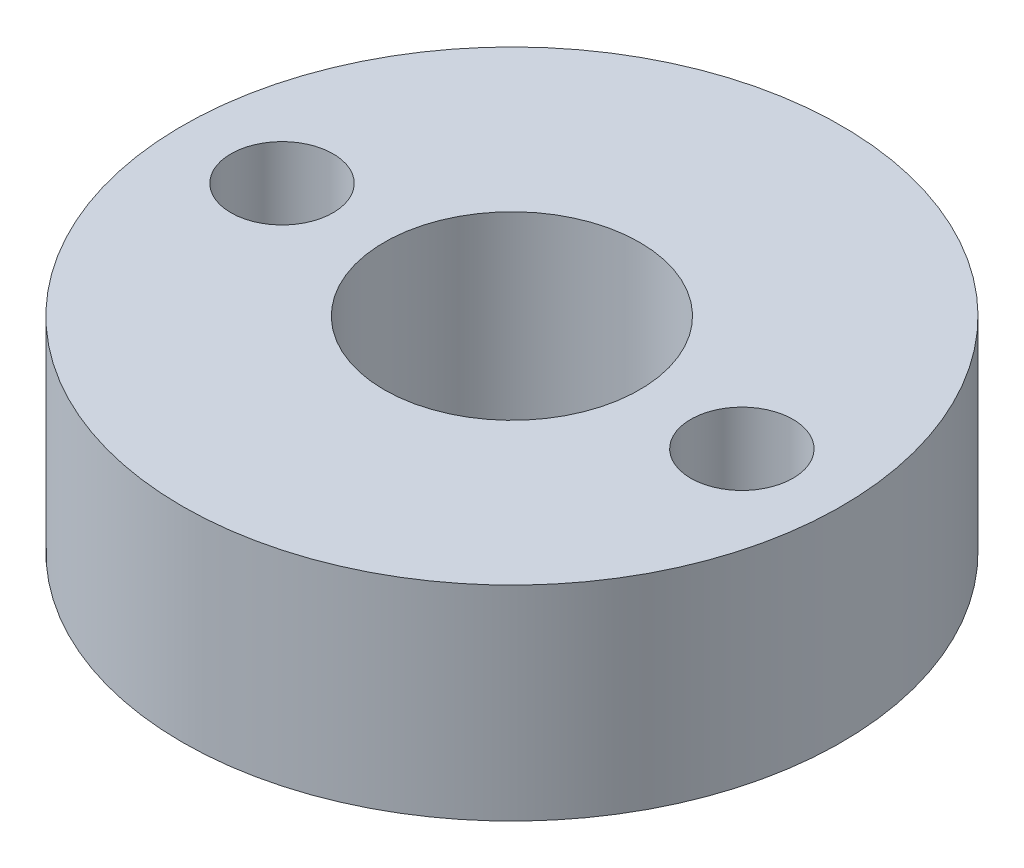
ISO-10303-21;
HEADER;
FILE_DESCRIPTION(('STEP AP214'),'2;1');
FILE_NAME('part.step','',(''),(''),'','','');
FILE_SCHEMA(('AUTOMOTIVE_DESIGN { 1 0 10303 214 1 1 1 1 }'));
ENDSEC;
DATA;
#1=APPLICATION_CONTEXT('core data for automotive mechanical design processes');
#2=APPLICATION_PROTOCOL_DEFINITION('international standard','automotive_design',2000,#1);
#3=PRODUCT_CONTEXT('',#1,'mechanical');
#4=PRODUCT('Part','Part','',(#3));
#5=PRODUCT_RELATED_PRODUCT_CATEGORY('part','',(#4));
#6=PRODUCT_DEFINITION_FORMATION('','',#4);
#7=PRODUCT_DEFINITION_CONTEXT('part definition',#1,'design');
#8=PRODUCT_DEFINITION('design','',#6,#7);
#9=PRODUCT_DEFINITION_SHAPE('','',#8);
#10=(LENGTH_UNIT() NAMED_UNIT(*) SI_UNIT(.MILLI.,.METRE.));
#11=(NAMED_UNIT(*) PLANE_ANGLE_UNIT() SI_UNIT($,.RADIAN.));
#12=(NAMED_UNIT(*) SI_UNIT($,.STERADIAN.) SOLID_ANGLE_UNIT());
#13=UNCERTAINTY_MEASURE_WITH_UNIT(LENGTH_MEASURE(1.E-05),#10,'distance_accuracy_value','');
#14=(GEOMETRIC_REPRESENTATION_CONTEXT(3) GLOBAL_UNCERTAINTY_ASSIGNED_CONTEXT((#13)) GLOBAL_UNIT_ASSIGNED_CONTEXT((#10,
#11,#12)) REPRESENTATION_CONTEXT('',''));
#15=CARTESIAN_POINT('',(0.,0.,0.));
#16=DIRECTION('',(0.,0.,1.));
#17=DIRECTION('',(1.,0.,0.));
#18=AXIS2_PLACEMENT_3D('',#15,#16,#17);
#19=CARTESIAN_POINT('',(0.,4.,0.));
#20=DIRECTION('',(0.,-1.,0.));
#21=DIRECTION('',(0.,0.,-1.));
#22=AXIS2_PLACEMENT_3D('',#19,#20,#21);
#23=CYLINDRICAL_SURFACE('',#22,6.45);
#24=CARTESIAN_POINT('',(0.,4.,0.));
#25=DIRECTION('',(0.,1.,0.));
#26=DIRECTION('',(0.,0.,1.));
#27=AXIS2_PLACEMENT_3D('',#24,#25,#26);
#28=CIRCLE('',#27,6.45);
#29=CARTESIAN_POINT('',(0.,4.,6.45));
#30=VERTEX_POINT('',#29);
#31=EDGE_CURVE('E10',#30,#30,#28,.T.);
#32=ORIENTED_EDGE('',*,*,#31,.F.);
#33=EDGE_LOOP('',(#32));
#34=FACE_BOUND('',#33,.T.);
#35=CARTESIAN_POINT('',(0.,0.,0.));
#36=DIRECTION('',(0.,1.,0.));
#37=DIRECTION('',(0.,0.,1.));
#38=AXIS2_PLACEMENT_3D('',#35,#36,#37);
#39=CIRCLE('',#38,6.45);
#40=CARTESIAN_POINT('',(0.,0.,6.45));
#41=VERTEX_POINT('',#40);
#42=EDGE_CURVE('E40',#41,#41,#39,.T.);
#43=ORIENTED_EDGE('',*,*,#42,.T.);
#44=EDGE_LOOP('',(#43));
#45=FACE_BOUND('',#44,.T.);
#46=ADVANCED_FACE('F37',(#34,#45),#23,.T.);
#47=CARTESIAN_POINT('',(0.,4.,0.));
#48=DIRECTION('',(0.,1.,0.));
#49=DIRECTION('',(0.,0.,1.));
#50=AXIS2_PLACEMENT_3D('',#47,#48,#49);
#51=PLANE('',#50);
#52=CARTESIAN_POINT('',(-4.5,4.,0.));
#53=DIRECTION('',(0.,1.,0.));
#54=DIRECTION('',(0.,0.,1.));
#55=AXIS2_PLACEMENT_3D('',#52,#53,#54);
#56=CIRCLE('',#55,1.);
#57=CARTESIAN_POINT('',(-4.5,4.,1.));
#58=VERTEX_POINT('',#57);
#59=EDGE_CURVE('E59',#58,#58,#56,.T.);
#60=ORIENTED_EDGE('',*,*,#59,.F.);
#61=EDGE_LOOP('',(#60));
#62=FACE_BOUND('',#61,.T.);
#63=CARTESIAN_POINT('',(4.5,4.,0.));
#64=DIRECTION('',(0.,1.,0.));
#65=DIRECTION('',(0.,0.,1.));
#66=AXIS2_PLACEMENT_3D('',#63,#64,#65);
#67=CIRCLE('',#66,1.);
#68=CARTESIAN_POINT('',(4.5,4.,1.));
#69=VERTEX_POINT('',#68);
#70=EDGE_CURVE('E67',#69,#69,#67,.T.);
#71=ORIENTED_EDGE('',*,*,#70,.F.);
#72=EDGE_LOOP('',(#71));
#73=FACE_BOUND('',#72,.T.);
#74=CARTESIAN_POINT('',(0.,4.,0.));
#75=DIRECTION('',(0.,1.,0.));
#76=DIRECTION('',(0.,0.,1.));
#77=AXIS2_PLACEMENT_3D('',#74,#75,#76);
#78=CIRCLE('',#77,2.5);
#79=CARTESIAN_POINT('',(0.,4.,2.5));
#80=VERTEX_POINT('',#79);
#81=EDGE_CURVE('E51',#80,#80,#78,.T.);
#82=ORIENTED_EDGE('',*,*,#81,.F.);
#83=EDGE_LOOP('',(#82));
#84=FACE_BOUND('',#83,.T.);
#85=ORIENTED_EDGE('',*,*,#31,.T.);
#86=EDGE_LOOP('',(#85));
#87=FACE_BOUND('',#86,.T.);
#88=ADVANCED_FACE('F86',(#62,#73,#84,#87),#51,.T.);
#89=CARTESIAN_POINT('',(0.,0.,0.));
#90=DIRECTION('',(0.,1.,0.));
#91=DIRECTION('',(0.,0.,1.));
#92=AXIS2_PLACEMENT_3D('',#89,#90,#91);
#93=PLANE('',#92);
#94=CARTESIAN_POINT('',(-4.5,0.,0.));
#95=DIRECTION('',(0.,1.,0.));
#96=DIRECTION('',(0.,0.,1.));
#97=AXIS2_PLACEMENT_3D('',#94,#95,#96);
#98=CIRCLE('',#97,1.);
#99=CARTESIAN_POINT('',(-4.5,0.,1.));
#100=VERTEX_POINT('',#99);
#101=EDGE_CURVE('E63',#100,#100,#98,.T.);
#102=ORIENTED_EDGE('',*,*,#101,.T.);
#103=EDGE_LOOP('',(#102));
#104=FACE_BOUND('',#103,.T.);
#105=CARTESIAN_POINT('',(4.5,0.,0.));
#106=DIRECTION('',(0.,1.,0.));
#107=DIRECTION('',(0.,0.,1.));
#108=AXIS2_PLACEMENT_3D('',#105,#106,#107);
#109=CIRCLE('',#108,1.);
#110=CARTESIAN_POINT('',(4.5,0.,1.));
#111=VERTEX_POINT('',#110);
#112=EDGE_CURVE('E55',#111,#111,#109,.T.);
#113=ORIENTED_EDGE('',*,*,#112,.T.);
#114=EDGE_LOOP('',(#113));
#115=FACE_BOUND('',#114,.T.);
#116=CARTESIAN_POINT('',(0.,0.,0.));
#117=DIRECTION('',(0.,1.,0.));
#118=DIRECTION('',(0.,0.,1.));
#119=AXIS2_PLACEMENT_3D('',#116,#117,#118);
#120=CIRCLE('',#119,2.5);
#121=CARTESIAN_POINT('',(0.,0.,2.5));
#122=VERTEX_POINT('',#121);
#123=EDGE_CURVE('E49',#122,#122,#120,.T.);
#124=ORIENTED_EDGE('',*,*,#123,.T.);
#125=EDGE_LOOP('',(#124));
#126=FACE_BOUND('',#125,.T.);
#127=ORIENTED_EDGE('',*,*,#42,.F.);
#128=EDGE_LOOP('',(#127));
#129=FACE_BOUND('',#128,.T.);
#130=ADVANCED_FACE('F75',(#104,#115,#126,#129),#93,.F.);
#131=CARTESIAN_POINT('',(0.,0.,0.));
#132=DIRECTION('',(0.,1.,0.));
#133=DIRECTION('',(0.,0.,1.));
#134=AXIS2_PLACEMENT_3D('',#131,#132,#133);
#135=CYLINDRICAL_SURFACE('',#134,2.5);
#136=ORIENTED_EDGE('',*,*,#123,.F.);
#137=EDGE_LOOP('',(#136));
#138=FACE_BOUND('',#137,.T.);
#139=ORIENTED_EDGE('',*,*,#81,.T.);
#140=EDGE_LOOP('',(#139));
#141=FACE_BOUND('',#140,.T.);
#142=ADVANCED_FACE('F82',(#138,#141),#135,.F.);
#143=CARTESIAN_POINT('',(4.5,0.,0.));
#144=DIRECTION('',(0.,1.,0.));
#145=DIRECTION('',(0.,0.,1.));
#146=AXIS2_PLACEMENT_3D('',#143,#144,#145);
#147=CYLINDRICAL_SURFACE('',#146,1.);
#148=ORIENTED_EDGE('',*,*,#112,.F.);
#149=EDGE_LOOP('',(#148));
#150=FACE_BOUND('',#149,.T.);
#151=ORIENTED_EDGE('',*,*,#70,.T.);
#152=EDGE_LOOP('',(#151));
#153=FACE_BOUND('',#152,.T.);
#154=ADVANCED_FACE('F78',(#150,#153),#147,.F.);
#155=CARTESIAN_POINT('',(-4.5,0.,0.));
#156=DIRECTION('',(0.,1.,0.));
#157=DIRECTION('',(0.,0.,1.));
#158=AXIS2_PLACEMENT_3D('',#155,#156,#157);
#159=CYLINDRICAL_SURFACE('',#158,1.);
#160=ORIENTED_EDGE('',*,*,#101,.F.);
#161=EDGE_LOOP('',(#160));
#162=FACE_BOUND('',#161,.T.);
#163=ORIENTED_EDGE('',*,*,#59,.T.);
#164=EDGE_LOOP('',(#163));
#165=FACE_BOUND('',#164,.T.);
#166=ADVANCED_FACE('F81',(#162,#165),#159,.F.);
#167=CLOSED_SHELL('',(#46,#88,#130,#142,#154,#166));
#168=MANIFOLD_SOLID_BREP('B2',#167);
#169=ADVANCED_BREP_SHAPE_REPRESENTATION('',(#18,#168),#14);
#170=SHAPE_DEFINITION_REPRESENTATION(#9,#169);
ENDSEC;
END-ISO-10303-21;
